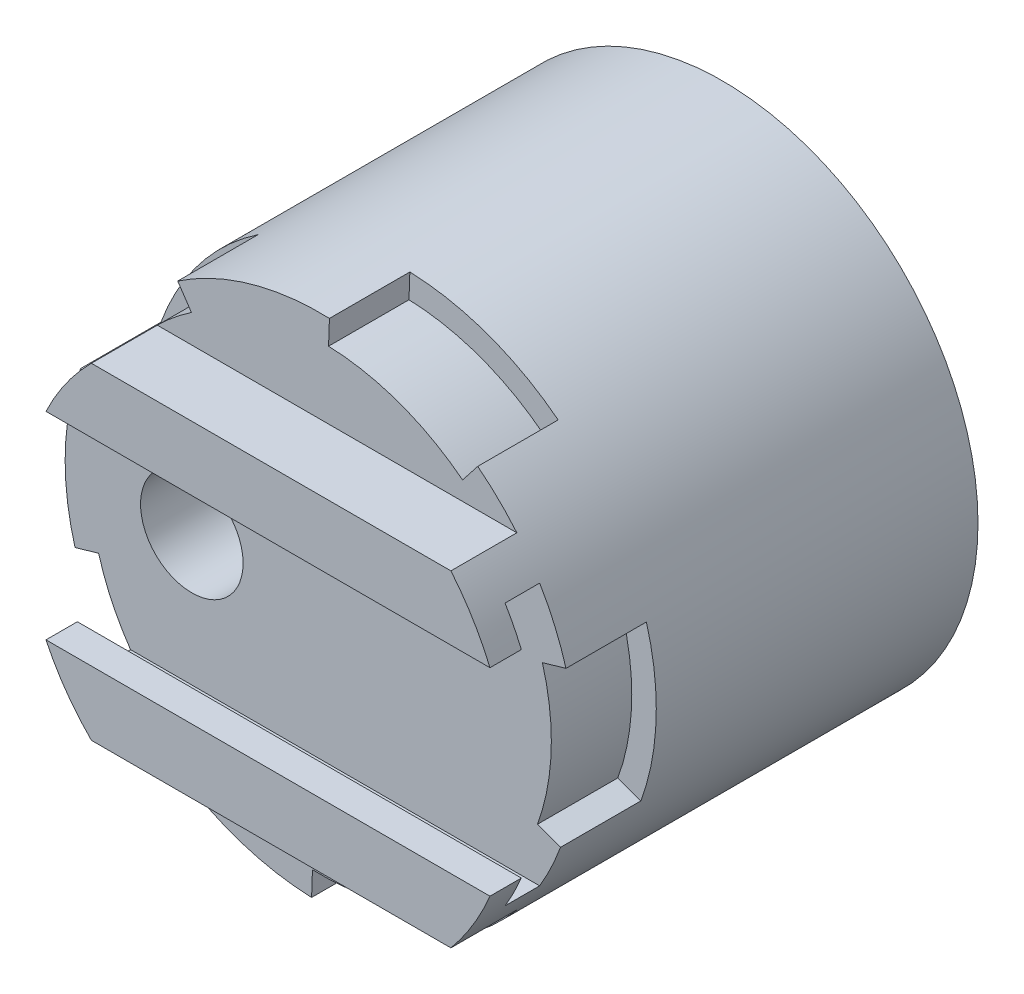
ISO-10303-21;
HEADER;
FILE_DESCRIPTION(('STEP AP214'),'2;1');
FILE_NAME('part.step','',(''),(''),'','','');
FILE_SCHEMA(('AUTOMOTIVE_DESIGN { 1 0 10303 214 1 1 1 1 }'));
ENDSEC;
DATA;
#1=APPLICATION_CONTEXT('core data for automotive mechanical design processes');
#2=APPLICATION_PROTOCOL_DEFINITION('international standard','automotive_design',2000,#1);
#3=PRODUCT_CONTEXT('',#1,'mechanical');
#4=PRODUCT('Part','Part','',(#3));
#5=PRODUCT_RELATED_PRODUCT_CATEGORY('part','',(#4));
#6=PRODUCT_DEFINITION_FORMATION('','',#4);
#7=PRODUCT_DEFINITION_CONTEXT('part definition',#1,'design');
#8=PRODUCT_DEFINITION('design','',#6,#7);
#9=PRODUCT_DEFINITION_SHAPE('','',#8);
#10=(LENGTH_UNIT() NAMED_UNIT(*) SI_UNIT(.MILLI.,.METRE.));
#11=(NAMED_UNIT(*) PLANE_ANGLE_UNIT() SI_UNIT($,.RADIAN.));
#12=(NAMED_UNIT(*) SI_UNIT($,.STERADIAN.) SOLID_ANGLE_UNIT());
#13=UNCERTAINTY_MEASURE_WITH_UNIT(LENGTH_MEASURE(1.E-05),#10,'distance_accuracy_value','');
#14=(GEOMETRIC_REPRESENTATION_CONTEXT(3) GLOBAL_UNCERTAINTY_ASSIGNED_CONTEXT((#13)) GLOBAL_UNIT_ASSIGNED_CONTEXT((#10,
#11,#12)) REPRESENTATION_CONTEXT('',''));
#15=CARTESIAN_POINT('',(0.,0.,0.));
#16=DIRECTION('',(0.,0.,1.));
#17=DIRECTION('',(1.,0.,0.));
#18=AXIS2_PLACEMENT_3D('',#15,#16,#17);
#19=CARTESIAN_POINT('',(-30.,-20.3,58.2));
#20=DIRECTION('',(0.,0.,1.));
#21=DIRECTION('',(1.,0.,0.));
#22=AXIS2_PLACEMENT_3D('',#19,#20,#21);
#23=PLANE('',#22);
#24=CARTESIAN_POINT('',(0.,0.,58.2));
#25=DIRECTION('',(0.,0.,1.));
#26=DIRECTION('',(1.,0.,0.));
#27=AXIS2_PLACEMENT_3D('',#24,#25,#26);
#28=CIRCLE('',#27,28.7);
#29=CARTESIAN_POINT('',(-25.9306768133807,-12.3,58.2));
#30=VERTEX_POINT('',#29);
#31=CARTESIAN_POINT('',(-20.2879274446652,-20.3,58.2));
#32=VERTEX_POINT('',#31);
#33=EDGE_CURVE('E453',#30,#32,#28,.T.);
#34=ORIENTED_EDGE('',*,*,#33,.T.);
#35=DIRECTION('',(1.,0.,0.));
#36=VECTOR('',#35,1.);
#37=CARTESIAN_POINT('',(-30.,-20.3,58.2));
#38=LINE('',#37,#36);
#39=CARTESIAN_POINT('',(24.412548003025,-20.3,58.2));
#40=VERTEX_POINT('',#39);
#41=EDGE_CURVE('E288',#32,#40,#38,.T.);
#42=ORIENTED_EDGE('',*,*,#41,.T.);
#43=CARTESIAN_POINT('',(0.,0.,58.2));
#44=DIRECTION('',(0.,0.,1.));
#45=DIRECTION('',(1.,0.,0.));
#46=AXIS2_PLACEMENT_3D('',#43,#44,#45);
#47=CIRCLE('',#46,31.75);
#48=CARTESIAN_POINT('',(29.2706764527231,-12.3,58.2));
#49=VERTEX_POINT('',#48);
#50=EDGE_CURVE('E55',#40,#49,#47,.T.);
#51=ORIENTED_EDGE('',*,*,#50,.T.);
#52=DIRECTION('',(1.,0.,0.));
#53=VECTOR('',#52,1.);
#54=CARTESIAN_POINT('',(-30.,-12.3,58.2));
#55=LINE('',#54,#53);
#56=EDGE_CURVE('E296',#30,#49,#55,.T.);
#57=ORIENTED_EDGE('',*,*,#56,.F.);
#58=EDGE_LOOP('',(#34,#42,#51,#57));
#59=FACE_BOUND('',#58,.T.);
#60=ADVANCED_FACE('F40',(#59),#23,.T.);
#61=CARTESIAN_POINT('',(-30.,-12.3,54.3));
#62=DIRECTION('',(0.,0.,-1.));
#63=DIRECTION('',(-1.,0.,0.));
#64=AXIS2_PLACEMENT_3D('',#61,#62,#63);
#65=PLANE('',#64);
#66=CARTESIAN_POINT('',(0.,0.,54.3));
#67=DIRECTION('',(0.,0.,-1.));
#68=DIRECTION('',(-1.,0.,0.));
#69=AXIS2_PLACEMENT_3D('',#66,#67,#68);
#70=CIRCLE('',#69,28.7);
#71=CARTESIAN_POINT('',(-25.9306768133807,-12.3,54.3));
#72=VERTEX_POINT('',#71);
#73=CARTESIAN_POINT('',(-23.6220236220354,-16.3,54.3));
#74=VERTEX_POINT('',#73);
#75=EDGE_CURVE('E253',#72,#74,#70,.F.);
#76=ORIENTED_EDGE('',*,*,#75,.F.);
#77=DIRECTION('',(1.,0.,0.));
#78=VECTOR('',#77,1.);
#79=CARTESIAN_POINT('',(-30.,-12.3,54.3));
#80=LINE('',#79,#78);
#81=CARTESIAN_POINT('',(29.2706764527231,-12.3,54.3));
#82=VERTEX_POINT('',#81);
#83=EDGE_CURVE('E505',#72,#82,#80,.T.);
#84=ORIENTED_EDGE('',*,*,#83,.T.);
#85=CARTESIAN_POINT('',(0.,0.,54.3));
#86=DIRECTION('',(0.,0.,-1.));
#87=DIRECTION('',(-1.,0.,0.));
#88=AXIS2_PLACEMENT_3D('',#85,#86,#87);
#89=CIRCLE('',#88,31.75);
#90=CARTESIAN_POINT('',(27.2465135384328,-16.3,54.3));
#91=VERTEX_POINT('',#90);
#92=EDGE_CURVE('E482',#91,#82,#89,.F.);
#93=ORIENTED_EDGE('',*,*,#92,.F.);
#94=DIRECTION('',(1.,0.,0.));
#95=VECTOR('',#94,1.);
#96=CARTESIAN_POINT('',(-30.,-16.3,54.3));
#97=LINE('',#96,#95);
#98=EDGE_CURVE('E285',#74,#91,#97,.T.);
#99=ORIENTED_EDGE('',*,*,#98,.F.);
#100=EDGE_LOOP('',(#76,#84,#93,#99));
#101=FACE_BOUND('',#100,.T.);
#102=ADVANCED_FACE('F510',(#101),#65,.T.);
#103=CARTESIAN_POINT('',(-30.,20.3,58.2));
#104=DIRECTION('',(0.,0.,-1.));
#105=DIRECTION('',(-1.,0.,0.));
#106=AXIS2_PLACEMENT_3D('',#103,#104,#105);
#107=PLANE('',#106);
#108=DIRECTION('',(1.,0.,0.));
#109=VECTOR('',#108,1.);
#110=CARTESIAN_POINT('',(-30.,12.3,58.2));
#111=LINE('',#110,#109);
#112=CARTESIAN_POINT('',(-25.9306768133807,12.3,58.2));
#113=VERTEX_POINT('',#112);
#114=CARTESIAN_POINT('',(29.2706764527231,12.3,58.2));
#115=VERTEX_POINT('',#114);
#116=EDGE_CURVE('E488',#113,#115,#111,.T.);
#117=ORIENTED_EDGE('',*,*,#116,.T.);
#118=CARTESIAN_POINT('',(0.,0.,58.2));
#119=DIRECTION('',(0.,0.,1.));
#120=DIRECTION('',(1.,0.,0.));
#121=AXIS2_PLACEMENT_3D('',#118,#119,#120);
#122=CIRCLE('',#121,31.75);
#123=CARTESIAN_POINT('',(24.412548003025,20.3,58.2));
#124=VERTEX_POINT('',#123);
#125=EDGE_CURVE('E62',#115,#124,#122,.T.);
#126=ORIENTED_EDGE('',*,*,#125,.T.);
#127=DIRECTION('',(1.,0.,0.));
#128=VECTOR('',#127,1.);
#129=CARTESIAN_POINT('',(-30.,20.3,58.2));
#130=LINE('',#129,#128);
#131=CARTESIAN_POINT('',(-20.2879274446652,20.3,58.2));
#132=VERTEX_POINT('',#131);
#133=EDGE_CURVE('E291',#132,#124,#130,.T.);
#134=ORIENTED_EDGE('',*,*,#133,.F.);
#135=CARTESIAN_POINT('',(0.,0.,58.2));
#136=DIRECTION('',(0.,0.,1.));
#137=DIRECTION('',(1.,0.,0.));
#138=AXIS2_PLACEMENT_3D('',#135,#136,#137);
#139=CIRCLE('',#138,28.7);
#140=EDGE_CURVE('E462',#132,#113,#139,.T.);
#141=ORIENTED_EDGE('',*,*,#140,.T.);
#142=EDGE_LOOP('',(#117,#126,#134,#141));
#143=FACE_BOUND('',#142,.T.);
#144=ADVANCED_FACE('F539',(#143),#107,.F.);
#145=CARTESIAN_POINT('',(-30.,12.3,54.3));
#146=DIRECTION('',(0.,0.,1.));
#147=DIRECTION('',(1.,0.,0.));
#148=AXIS2_PLACEMENT_3D('',#145,#146,#147);
#149=PLANE('',#148);
#150=DIRECTION('',(1.,0.,0.));
#151=VECTOR('',#150,1.);
#152=CARTESIAN_POINT('',(-30.,16.3,54.3));
#153=LINE('',#152,#151);
#154=CARTESIAN_POINT('',(-23.6220236220354,16.3,54.3));
#155=VERTEX_POINT('',#154);
#156=CARTESIAN_POINT('',(27.2465135384328,16.3,54.3));
#157=VERTEX_POINT('',#156);
#158=EDGE_CURVE('E497',#155,#157,#153,.T.);
#159=ORIENTED_EDGE('',*,*,#158,.T.);
#160=CARTESIAN_POINT('',(0.,0.,54.3));
#161=DIRECTION('',(0.,0.,1.));
#162=DIRECTION('',(1.,0.,0.));
#163=AXIS2_PLACEMENT_3D('',#160,#161,#162);
#164=CIRCLE('',#163,31.75);
#165=CARTESIAN_POINT('',(29.2706764527231,12.3,54.3));
#166=VERTEX_POINT('',#165);
#167=EDGE_CURVE('E473',#157,#166,#164,.F.);
#168=ORIENTED_EDGE('',*,*,#167,.T.);
#169=DIRECTION('',(1.,0.,0.));
#170=VECTOR('',#169,1.);
#171=CARTESIAN_POINT('',(-30.,12.3,54.3));
#172=LINE('',#171,#170);
#173=CARTESIAN_POINT('',(-25.9306768133807,12.3,54.3));
#174=VERTEX_POINT('',#173);
#175=EDGE_CURVE('E500',#174,#166,#172,.T.);
#176=ORIENTED_EDGE('',*,*,#175,.F.);
#177=CARTESIAN_POINT('',(0.,0.,54.3));
#178=DIRECTION('',(0.,0.,1.));
#179=DIRECTION('',(1.,0.,0.));
#180=AXIS2_PLACEMENT_3D('',#177,#178,#179);
#181=CIRCLE('',#180,28.7);
#182=EDGE_CURVE('E465',#174,#155,#181,.F.);
#183=ORIENTED_EDGE('',*,*,#182,.T.);
#184=EDGE_LOOP('',(#159,#168,#176,#183));
#185=FACE_BOUND('',#184,.T.);
#186=ADVANCED_FACE('F616',(#185),#149,.F.);
#187=CARTESIAN_POINT('',(0.,0.,50.));
#188=DIRECTION('',(0.,0.,1.));
#189=DIRECTION('',(1.,0.,0.));
#190=AXIS2_PLACEMENT_3D('',#187,#188,#189);
#191=PLANE('',#190);
#192=CARTESIAN_POINT('',(0.,0.,50.));
#193=DIRECTION('',(0.,0.,1.));
#194=DIRECTION('',(1.,0.,0.));
#195=AXIS2_PLACEMENT_3D('',#192,#193,#194);
#196=CIRCLE('',#195,28.7);
#197=CARTESIAN_POINT('',(-16.0488363296106,23.7933783323296,50.));
#198=VERTEX_POINT('',#197);
#199=CARTESIAN_POINT('',(-20.2879274446652,20.3,50.));
#200=VERTEX_POINT('',#199);
#201=EDGE_CURVE('E274',#198,#200,#196,.T.);
#202=ORIENTED_EDGE('',*,*,#201,.T.);
#203=DIRECTION('',(1.,0.,0.));
#204=VECTOR('',#203,1.);
#205=CARTESIAN_POINT('',(-30.,20.3,50.));
#206=LINE('',#205,#204);
#207=CARTESIAN_POINT('',(24.412548003025,20.3,50.));
#208=VERTEX_POINT('',#207);
#209=EDGE_CURVE('E491',#200,#208,#206,.T.);
#210=ORIENTED_EDGE('',*,*,#209,.T.);
#211=CARTESIAN_POINT('',(0.,0.,50.));
#212=DIRECTION('',(0.,0.,1.));
#213=DIRECTION('',(1.,0.,0.));
#214=AXIS2_PLACEMENT_3D('',#211,#212,#213);
#215=CIRCLE('',#214,31.75);
#216=CARTESIAN_POINT('',(19.5472518415895,25.0193414270136,50.));
#217=VERTEX_POINT('',#216);
#218=EDGE_CURVE('E347',#208,#217,#215,.T.);
#219=ORIENTED_EDGE('',*,*,#218,.T.);
#220=DIRECTION('',(0.615661475325653,0.788010753606726,0.));
#221=VECTOR('',#220,1.);
#222=CARTESIAN_POINT('',(0.,0.,50.));
#223=LINE('',#222,#221);
#224=CARTESIAN_POINT('',(17.6694843418462,22.615908628513,50.));
#225=VERTEX_POINT('',#224);
#226=EDGE_CURVE('E350',#225,#217,#223,.T.);
#227=ORIENTED_EDGE('',*,*,#226,.F.);
#228=CARTESIAN_POINT('',(1.00161555536159,28.6825167354481,50.));
#229=VERTEX_POINT('',#228);
#230=EDGE_CURVE('E628',#225,#229,#196,.T.);
#231=ORIENTED_EDGE('',*,*,#230,.T.);
#232=DIRECTION('',(-0.0348994967024945,-0.999390827019096,0.));
#233=VECTOR('',#232,1.);
#234=CARTESIAN_POINT('',(0.,0.,50.));
#235=LINE('',#234,#233);
#236=CARTESIAN_POINT('',(1.1080590203042,31.7306587578563,50.));
#237=VERTEX_POINT('',#236);
#238=EDGE_CURVE('E370',#237,#229,#235,.T.);
#239=ORIENTED_EDGE('',*,*,#238,.F.);
#240=CARTESIAN_POINT('',(0.,0.,50.));
#241=DIRECTION('',(0.,0.,1.));
#242=DIRECTION('',(1.,0.,0.));
#243=AXIS2_PLACEMENT_3D('',#240,#241,#242);
#244=CIRCLE('',#243,31.75);
#245=CARTESIAN_POINT('',(-17.7543746851964,26.3219429286225,50.));
#246=VERTEX_POINT('',#245);
#247=EDGE_CURVE('E373',#237,#246,#244,.T.);
#248=ORIENTED_EDGE('',*,*,#247,.T.);
#249=DIRECTION('',(-0.559192903470752,0.829037572555038,0.));
#250=VECTOR('',#249,1.);
#251=CARTESIAN_POINT('',(0.,0.,50.));
#252=LINE('',#251,#250);
#253=EDGE_CURVE('E376',#198,#246,#252,.T.);
#254=ORIENTED_EDGE('',*,*,#253,.F.);
#255=EDGE_LOOP('',(#202,#210,#219,#227,#231,#239,#248,#254));
#256=FACE_BOUND('',#255,.T.);
#257=ADVANCED_FACE('F593',(#256),#191,.T.);
#258=CARTESIAN_POINT('',(-16.,0.,50.));
#259=DIRECTION('',(0.,0.,1.));
#260=DIRECTION('',(1.,0.,0.));
#261=AXIS2_PLACEMENT_3D('',#258,#259,#260);
#262=CIRCLE('',#261,6.375);
#263=CARTESIAN_POINT('',(-9.625,0.,50.));
#264=VERTEX_POINT('',#263);
#265=EDGE_CURVE('E420',#264,#264,#262,.F.);
#266=ORIENTED_EDGE('',*,*,#265,.T.);
#267=EDGE_LOOP('',(#266));
#268=FACE_BOUND('',#267,.T.);
#269=CARTESIAN_POINT('',(30.5200588460416,8.75148604718993,50.));
#270=VERTEX_POINT('',#269);
#271=CARTESIAN_POINT('',(27.2465135384328,16.3,50.));
#272=VERTEX_POINT('',#271);
#273=EDGE_CURVE('E348',#270,#272,#215,.T.);
#274=ORIENTED_EDGE('',*,*,#273,.T.);
#275=DIRECTION('',(1.,0.,0.));
#276=VECTOR('',#275,1.);
#277=CARTESIAN_POINT('',(-30.,16.3,50.));
#278=LINE('',#277,#276);
#279=CARTESIAN_POINT('',(-23.6220236220354,16.3,50.));
#280=VERTEX_POINT('',#279);
#281=EDGE_CURVE('E494',#280,#272,#278,.T.);
#282=ORIENTED_EDGE('',*,*,#281,.F.);
#283=CARTESIAN_POINT('',(-26.9691782165556,9.81597811344652,50.));
#284=VERTEX_POINT('',#283);
#285=EDGE_CURVE('E273',#280,#284,#196,.T.);
#286=ORIENTED_EDGE('',*,*,#285,.T.);
#287=DIRECTION('',(0.939692620785911,-0.342020143325663,0.));
#288=VECTOR('',#287,1.);
#289=CARTESIAN_POINT('',(0.,0.,50.));
#290=LINE('',#289,#288);
#291=CARTESIAN_POINT('',(-29.8352407099527,10.8591395505898,50.));
#292=VERTEX_POINT('',#291);
#293=EDGE_CURVE('E395',#292,#284,#290,.T.);
#294=ORIENTED_EDGE('',*,*,#293,.F.);
#295=CARTESIAN_POINT('',(0.,0.,50.));
#296=DIRECTION('',(0.,0.,1.));
#297=DIRECTION('',(1.,0.,0.));
#298=AXIS2_PLACEMENT_3D('',#295,#296,#297);
#299=CIRCLE('',#298,31.75);
#300=CARTESIAN_POINT('',(-30.5200588460416,-8.75148604718992,50.));
#301=VERTEX_POINT('',#300);
#302=EDGE_CURVE('E396',#292,#301,#299,.T.);
#303=ORIENTED_EDGE('',*,*,#302,.T.);
#304=DIRECTION('',(-0.961261695938317,-0.275637355817006,0.));
#305=VECTOR('',#304,1.);
#306=CARTESIAN_POINT('',(0.,0.,50.));
#307=LINE('',#306,#305);
#308=CARTESIAN_POINT('',(-27.5882106734297,-7.91079211194806,50.));
#309=VERTEX_POINT('',#308);
#310=EDGE_CURVE('E269',#309,#301,#307,.T.);
#311=ORIENTED_EDGE('',*,*,#310,.F.);
#312=CARTESIAN_POINT('',(-23.6220236220354,-16.3,50.));
#313=VERTEX_POINT('',#312);
#314=EDGE_CURVE('E250',#309,#313,#196,.T.);
#315=ORIENTED_EDGE('',*,*,#314,.T.);
#316=DIRECTION('',(1.,0.,0.));
#317=VECTOR('',#316,1.);
#318=CARTESIAN_POINT('',(-30.,-16.3,50.));
#319=LINE('',#318,#317);
#320=CARTESIAN_POINT('',(27.2465135384328,-16.3,50.));
#321=VERTEX_POINT('',#320);
#322=EDGE_CURVE('E265',#313,#321,#319,.T.);
#323=ORIENTED_EDGE('',*,*,#322,.T.);
#324=CARTESIAN_POINT('',(0.,0.,50.));
#325=DIRECTION('',(0.,0.,1.));
#326=DIRECTION('',(1.,0.,0.));
#327=AXIS2_PLACEMENT_3D('',#324,#325,#326);
#328=CIRCLE('',#327,31.75);
#329=CARTESIAN_POINT('',(29.8352407099527,-10.8591395505898,50.));
#330=VERTEX_POINT('',#329);
#331=EDGE_CURVE('E320',#321,#330,#328,.T.);
#332=ORIENTED_EDGE('',*,*,#331,.T.);
#333=DIRECTION('',(0.939692620785911,-0.342020143325663,0.));
#334=VECTOR('',#333,1.);
#335=CARTESIAN_POINT('',(0.,0.,50.));
#336=LINE('',#335,#334);
#337=CARTESIAN_POINT('',(26.9691782165556,-9.81597811344652,50.));
#338=VERTEX_POINT('',#337);
#339=EDGE_CURVE('E324',#338,#330,#336,.T.);
#340=ORIENTED_EDGE('',*,*,#339,.F.);
#341=CARTESIAN_POINT('',(27.5882106734297,7.91079211194806,50.));
#342=VERTEX_POINT('',#341);
#343=EDGE_CURVE('E656',#338,#342,#196,.T.);
#344=ORIENTED_EDGE('',*,*,#343,.T.);
#345=DIRECTION('',(-0.961261695938317,-0.275637355817006,0.));
#346=VECTOR('',#345,1.);
#347=CARTESIAN_POINT('',(0.,0.,50.));
#348=LINE('',#347,#346);
#349=EDGE_CURVE('E344',#270,#342,#348,.T.);
#350=ORIENTED_EDGE('',*,*,#349,.F.);
#351=EDGE_LOOP('',(#274,#282,#286,#294,#303,#311,#315,#323,#332,#340,#344,#350));
#352=FACE_BOUND('',#351,.T.);
#353=ADVANCED_FACE('F264',(#268,#352),#191,.T.);
#354=CARTESIAN_POINT('',(0.,0.,50.));
#355=DIRECTION('',(0.,0.,-1.));
#356=DIRECTION('',(-1.,0.,0.));
#357=AXIS2_PLACEMENT_3D('',#354,#355,#356);
#358=CYLINDRICAL_SURFACE('',#357,28.7);
#359=DIRECTION('',(0.,0.,1.));
#360=VECTOR('',#359,1.);
#361=CARTESIAN_POINT('',(-1.00161555536159,-28.6825167354481,-500000.));
#362=LINE('',#361,#360);
#363=CARTESIAN_POINT('',(-1.00161555536159,-28.6825167354481,40.));
#364=VERTEX_POINT('',#363);
#365=CARTESIAN_POINT('',(-1.00161555536159,-28.6825167354481,50.));
#366=VERTEX_POINT('',#365);
#367=EDGE_CURVE('E304',#364,#366,#362,.T.);
#368=ORIENTED_EDGE('',*,*,#367,.F.);
#369=CARTESIAN_POINT('',(0.,0.,40.));
#370=DIRECTION('',(0.,0.,1.));
#371=DIRECTION('',(1.,0.,0.));
#372=AXIS2_PLACEMENT_3D('',#369,#370,#371);
#373=CIRCLE('',#372,28.7);
#374=CARTESIAN_POINT('',(16.0488363296106,-23.7933783323296,40.));
#375=VERTEX_POINT('',#374);
#376=EDGE_CURVE('E433',#364,#375,#373,.T.);
#377=ORIENTED_EDGE('',*,*,#376,.T.);
#378=DIRECTION('',(0.,0.,1.));
#379=VECTOR('',#378,1.);
#380=CARTESIAN_POINT('',(16.0488363296106,-23.7933783323296,-500000.));
#381=LINE('',#380,#379);
#382=CARTESIAN_POINT('',(16.0488363296106,-23.7933783323296,50.));
#383=VERTEX_POINT('',#382);
#384=EDGE_CURVE('E327',#375,#383,#381,.T.);
#385=ORIENTED_EDGE('',*,*,#384,.T.);
#386=EDGE_CURVE('E654',#366,#383,#196,.T.);
#387=ORIENTED_EDGE('',*,*,#386,.F.);
#388=EDGE_LOOP('',(#368,#377,#385,#387));
#389=FACE_BOUND('',#388,.T.);
#390=ADVANCED_FACE('F609',(#389),#358,.T.);
#391=DIRECTION('',(0.,0.,1.));
#392=VECTOR('',#391,1.);
#393=CARTESIAN_POINT('',(-17.6694843418462,-22.615908628513,-500000.));
#394=LINE('',#393,#392);
#395=CARTESIAN_POINT('',(-17.6694843418462,-22.615908628513,40.));
#396=VERTEX_POINT('',#395);
#397=CARTESIAN_POINT('',(-17.6694843418462,-22.615908628513,50.));
#398=VERTEX_POINT('',#397);
#399=EDGE_CURVE('E302',#396,#398,#394,.T.);
#400=ORIENTED_EDGE('',*,*,#399,.T.);
#401=CARTESIAN_POINT('',(-20.2879274446652,-20.3,50.));
#402=VERTEX_POINT('',#401);
#403=EDGE_CURVE('E271',#402,#398,#196,.T.);
#404=ORIENTED_EDGE('',*,*,#403,.F.);
#405=DIRECTION('',(0.,0.,-1.));
#406=VECTOR('',#405,1.);
#407=CARTESIAN_POINT('',(-20.2879274446652,-20.3,58.2));
#408=LINE('',#407,#406);
#409=EDGE_CURVE('E13',#402,#32,#408,.F.);
#410=ORIENTED_EDGE('',*,*,#409,.T.);
#411=ORIENTED_EDGE('',*,*,#33,.F.);
#412=DIRECTION('',(0.,0.,-1.));
#413=VECTOR('',#412,1.);
#414=CARTESIAN_POINT('',(-25.9306768133807,-12.3,58.2));
#415=LINE('',#414,#413);
#416=EDGE_CURVE('E486',#30,#72,#415,.T.);
#417=ORIENTED_EDGE('',*,*,#416,.T.);
#418=ORIENTED_EDGE('',*,*,#75,.T.);
#419=DIRECTION('',(0.,0.,-1.));
#420=VECTOR('',#419,1.);
#421=CARTESIAN_POINT('',(-23.6220236220354,-16.3,58.2));
#422=LINE('',#421,#420);
#423=EDGE_CURVE('E246',#74,#313,#422,.T.);
#424=ORIENTED_EDGE('',*,*,#423,.T.);
#425=ORIENTED_EDGE('',*,*,#314,.F.);
#426=DIRECTION('',(0.,0.,1.));
#427=VECTOR('',#426,1.);
#428=CARTESIAN_POINT('',(-27.5882106734297,-7.91079211194806,-500000.));
#429=LINE('',#428,#427);
#430=CARTESIAN_POINT('',(-27.5882106734297,-7.91079211194806,40.));
#431=VERTEX_POINT('',#430);
#432=EDGE_CURVE('E399',#431,#309,#429,.T.);
#433=ORIENTED_EDGE('',*,*,#432,.F.);
#434=EDGE_CURVE('E429',#431,#396,#373,.T.);
#435=ORIENTED_EDGE('',*,*,#434,.T.);
#436=EDGE_LOOP('',(#400,#404,#410,#411,#417,#418,#424,#425,#433,#435));
#437=FACE_BOUND('',#436,.T.);
#438=ADVANCED_FACE('F249',(#437),#358,.T.);
#439=CARTESIAN_POINT('',(0.,0.,40.));
#440=DIRECTION('',(0.,0.,1.));
#441=DIRECTION('',(1.,0.,0.));
#442=AXIS2_PLACEMENT_3D('',#439,#440,#441);
#443=PLANE('',#442);
#444=ORIENTED_EDGE('',*,*,#376,.F.);
#445=DIRECTION('',(0.0348994967024945,0.999390827019096,0.));
#446=VECTOR('',#445,1.);
#447=CARTESIAN_POINT('',(0.,0.,40.0000000000205));
#448=LINE('',#447,#446);
#449=CARTESIAN_POINT('',(-1.1080590203042,-31.7306587578563,39.9999999999068));
#450=VERTEX_POINT('',#449);
#451=EDGE_CURVE('E311',#450,#364,#448,.T.);
#452=ORIENTED_EDGE('',*,*,#451,.F.);
#453=CARTESIAN_POINT('',(0.,0.,40.));
#454=DIRECTION('',(0.,0.,1.));
#455=DIRECTION('',(1.,0.,0.));
#456=AXIS2_PLACEMENT_3D('',#453,#454,#455);
#457=CIRCLE('',#456,31.75);
#458=CARTESIAN_POINT('',(17.7543746851964,-26.3219429286225,40.));
#459=VERTEX_POINT('',#458);
#460=EDGE_CURVE('E436',#450,#459,#457,.T.);
#461=ORIENTED_EDGE('',*,*,#460,.T.);
#462=DIRECTION('',(0.559192903470752,-0.829037572555038,0.));
#463=VECTOR('',#462,1.);
#464=CARTESIAN_POINT('',(0.,0.,40.0000000000205));
#465=LINE('',#464,#463);
#466=EDGE_CURVE('E341',#375,#459,#465,.T.);
#467=ORIENTED_EDGE('',*,*,#466,.F.);
#468=EDGE_LOOP('',(#444,#452,#461,#467));
#469=FACE_BOUND('',#468,.T.);
#470=ADVANCED_FACE('F589',(#469),#443,.T.);
#471=CARTESIAN_POINT('',(-30.5200588460416,-8.75148604718992,39.9999999999068));
#472=VERTEX_POINT('',#471);
#473=CARTESIAN_POINT('',(-19.5472518415895,-25.0193414270136,40.));
#474=VERTEX_POINT('',#473);
#475=EDGE_CURVE('E434',#472,#474,#457,.T.);
#476=ORIENTED_EDGE('',*,*,#475,.T.);
#477=DIRECTION('',(-0.615661475325653,-0.788010753606726,0.));
#478=VECTOR('',#477,1.);
#479=CARTESIAN_POINT('',(0.,0.,40.0000000000205));
#480=LINE('',#479,#478);
#481=EDGE_CURVE('E314',#396,#474,#480,.T.);
#482=ORIENTED_EDGE('',*,*,#481,.F.);
#483=ORIENTED_EDGE('',*,*,#434,.F.);
#484=DIRECTION('',(0.961261695938317,0.275637355817005,0.));
#485=VECTOR('',#484,1.);
#486=CARTESIAN_POINT('',(0.,0.,40.0000000000205));
#487=LINE('',#486,#485);
#488=EDGE_CURVE('E410',#472,#431,#487,.T.);
#489=ORIENTED_EDGE('',*,*,#488,.F.);
#490=EDGE_LOOP('',(#476,#482,#483,#489));
#491=FACE_BOUND('',#490,.T.);
#492=ADVANCED_FACE('F833',(#491),#443,.T.);
#493=DIRECTION('',(0.,0.,1.));
#494=VECTOR('',#493,1.);
#495=CARTESIAN_POINT('',(26.9691782165556,-9.81597811344652,-500000.));
#496=LINE('',#495,#494);
#497=CARTESIAN_POINT('',(26.9691782165556,-9.81597811344652,40.));
#498=VERTEX_POINT('',#497);
#499=EDGE_CURVE('E330',#498,#338,#496,.T.);
#500=ORIENTED_EDGE('',*,*,#499,.F.);
#501=CARTESIAN_POINT('',(27.5882106734297,7.91079211194806,40.));
#502=VERTEX_POINT('',#501);
#503=EDGE_CURVE('E644',#498,#502,#373,.T.);
#504=ORIENTED_EDGE('',*,*,#503,.T.);
#505=DIRECTION('',(0.,0.,1.));
#506=VECTOR('',#505,1.);
#507=CARTESIAN_POINT('',(27.5882106734297,7.91079211194806,-500000.));
#508=LINE('',#507,#506);
#509=EDGE_CURVE('E353',#502,#342,#508,.T.);
#510=ORIENTED_EDGE('',*,*,#509,.T.);
#511=ORIENTED_EDGE('',*,*,#343,.F.);
#512=EDGE_LOOP('',(#500,#504,#510,#511));
#513=FACE_BOUND('',#512,.T.);
#514=ADVANCED_FACE('F662',(#513),#358,.T.);
#515=ORIENTED_EDGE('',*,*,#503,.F.);
#516=DIRECTION('',(-0.939692620785911,0.342020143325663,0.));
#517=VECTOR('',#516,1.);
#518=CARTESIAN_POINT('',(0.,0.,40.0000000000205));
#519=LINE('',#518,#517);
#520=CARTESIAN_POINT('',(29.8352407099527,-10.8591395505898,39.9999999999068));
#521=VERTEX_POINT('',#520);
#522=EDGE_CURVE('E338',#521,#498,#519,.T.);
#523=ORIENTED_EDGE('',*,*,#522,.F.);
#524=CARTESIAN_POINT('',(30.5200588460416,8.75148604718992,40.));
#525=VERTEX_POINT('',#524);
#526=EDGE_CURVE('E937',#521,#525,#457,.T.);
#527=ORIENTED_EDGE('',*,*,#526,.T.);
#528=DIRECTION('',(0.961261695938317,0.275637355817005,0.));
#529=VECTOR('',#528,1.);
#530=CARTESIAN_POINT('',(0.,0.,40.0000000000205));
#531=LINE('',#530,#529);
#532=EDGE_CURVE('E367',#502,#525,#531,.T.);
#533=ORIENTED_EDGE('',*,*,#532,.F.);
#534=EDGE_LOOP('',(#515,#523,#527,#533));
#535=FACE_BOUND('',#534,.T.);
#536=ADVANCED_FACE('F819',(#535),#443,.T.);
#537=DIRECTION('',(0.,0.,1.));
#538=VECTOR('',#537,1.);
#539=CARTESIAN_POINT('',(17.6694843418462,22.615908628513,-500000.));
#540=LINE('',#539,#538);
#541=CARTESIAN_POINT('',(17.6694843418462,22.615908628513,40.));
#542=VERTEX_POINT('',#541);
#543=EDGE_CURVE('E356',#542,#225,#540,.T.);
#544=ORIENTED_EDGE('',*,*,#543,.F.);
#545=CARTESIAN_POINT('',(1.00161555536159,28.6825167354481,40.));
#546=VERTEX_POINT('',#545);
#547=EDGE_CURVE('E640',#542,#546,#373,.T.);
#548=ORIENTED_EDGE('',*,*,#547,.T.);
#549=DIRECTION('',(0.,0.,1.));
#550=VECTOR('',#549,1.);
#551=CARTESIAN_POINT('',(1.00161555536159,28.6825167354481,-500000.));
#552=LINE('',#551,#550);
#553=EDGE_CURVE('E379',#546,#229,#552,.T.);
#554=ORIENTED_EDGE('',*,*,#553,.T.);
#555=ORIENTED_EDGE('',*,*,#230,.F.);
#556=EDGE_LOOP('',(#544,#548,#554,#555));
#557=FACE_BOUND('',#556,.T.);
#558=ADVANCED_FACE('F639',(#557),#358,.T.);
#559=ORIENTED_EDGE('',*,*,#547,.F.);
#560=DIRECTION('',(-0.615661475325653,-0.788010753606726,0.));
#561=VECTOR('',#560,1.);
#562=CARTESIAN_POINT('',(0.,0.,40.0000000000205));
#563=LINE('',#562,#561);
#564=CARTESIAN_POINT('',(19.5472518415895,25.0193414270136,39.9999999999068));
#565=VERTEX_POINT('',#564);
#566=EDGE_CURVE('E364',#565,#542,#563,.T.);
#567=ORIENTED_EDGE('',*,*,#566,.F.);
#568=CARTESIAN_POINT('',(1.1080590203042,31.7306587578563,40.));
#569=VERTEX_POINT('',#568);
#570=EDGE_CURVE('E938',#565,#569,#457,.T.);
#571=ORIENTED_EDGE('',*,*,#570,.T.);
#572=DIRECTION('',(0.0348994967024945,0.999390827019096,0.));
#573=VECTOR('',#572,1.);
#574=CARTESIAN_POINT('',(0.,0.,40.0000000000205));
#575=LINE('',#574,#573);
#576=EDGE_CURVE('E392',#546,#569,#575,.T.);
#577=ORIENTED_EDGE('',*,*,#576,.F.);
#578=EDGE_LOOP('',(#559,#567,#571,#577));
#579=FACE_BOUND('',#578,.T.);
#580=ADVANCED_FACE('F590',(#579),#443,.T.);
#581=DIRECTION('',(0.,0.,1.));
#582=VECTOR('',#581,1.);
#583=CARTESIAN_POINT('',(-16.0488363296106,23.7933783323296,-500000.));
#584=LINE('',#583,#582);
#585=CARTESIAN_POINT('',(-16.0488363296106,23.7933783323296,40.));
#586=VERTEX_POINT('',#585);
#587=EDGE_CURVE('E382',#586,#198,#584,.T.);
#588=ORIENTED_EDGE('',*,*,#587,.F.);
#589=CARTESIAN_POINT('',(-26.9691782165556,9.81597811344652,40.));
#590=VERTEX_POINT('',#589);
#591=EDGE_CURVE('E428',#586,#590,#373,.T.);
#592=ORIENTED_EDGE('',*,*,#591,.T.);
#593=DIRECTION('',(0.,0.,1.));
#594=VECTOR('',#593,1.);
#595=CARTESIAN_POINT('',(-26.9691782165556,9.81597811344652,-500000.));
#596=LINE('',#595,#594);
#597=EDGE_CURVE('E407',#590,#284,#596,.T.);
#598=ORIENTED_EDGE('',*,*,#597,.T.);
#599=ORIENTED_EDGE('',*,*,#285,.F.);
#600=DIRECTION('',(0.,0.,-1.));
#601=VECTOR('',#600,1.);
#602=CARTESIAN_POINT('',(-23.6220236220354,16.3,58.2));
#603=LINE('',#602,#601);
#604=EDGE_CURVE('E468',#155,#280,#603,.T.);
#605=ORIENTED_EDGE('',*,*,#604,.F.);
#606=ORIENTED_EDGE('',*,*,#182,.F.);
#607=DIRECTION('',(0.,0.,-1.));
#608=VECTOR('',#607,1.);
#609=CARTESIAN_POINT('',(-25.9306768133807,12.3,58.2));
#610=LINE('',#609,#608);
#611=EDGE_CURVE('E277',#113,#174,#610,.T.);
#612=ORIENTED_EDGE('',*,*,#611,.F.);
#613=ORIENTED_EDGE('',*,*,#140,.F.);
#614=DIRECTION('',(0.,0.,-1.));
#615=VECTOR('',#614,1.);
#616=CARTESIAN_POINT('',(-20.2879274446652,20.3,58.2));
#617=LINE('',#616,#615);
#618=EDGE_CURVE('E470',#200,#132,#617,.F.);
#619=ORIENTED_EDGE('',*,*,#618,.F.);
#620=ORIENTED_EDGE('',*,*,#201,.F.);
#621=EDGE_LOOP('',(#588,#592,#598,#599,#605,#606,#612,#613,#619,#620));
#622=FACE_BOUND('',#621,.T.);
#623=ADVANCED_FACE('F42',(#622),#358,.T.);
#624=ORIENTED_EDGE('',*,*,#591,.F.);
#625=DIRECTION('',(0.559192903470752,-0.829037572555038,0.));
#626=VECTOR('',#625,1.);
#627=CARTESIAN_POINT('',(0.,0.,40.0000000000205));
#628=LINE('',#627,#626);
#629=CARTESIAN_POINT('',(-17.7543746851964,26.3219429286225,39.9999999999068));
#630=VERTEX_POINT('',#629);
#631=EDGE_CURVE('E389',#630,#586,#628,.T.);
#632=ORIENTED_EDGE('',*,*,#631,.F.);
#633=CARTESIAN_POINT('',(-29.8352407099527,10.8591395505898,40.));
#634=VERTEX_POINT('',#633);
#635=EDGE_CURVE('E437',#630,#634,#457,.T.);
#636=ORIENTED_EDGE('',*,*,#635,.T.);
#637=DIRECTION('',(-0.939692620785911,0.342020143325663,0.));
#638=VECTOR('',#637,1.);
#639=CARTESIAN_POINT('',(0.,0.,40.0000000000205));
#640=LINE('',#639,#638);
#641=EDGE_CURVE('E413',#590,#634,#640,.T.);
#642=ORIENTED_EDGE('',*,*,#641,.F.);
#643=EDGE_LOOP('',(#624,#632,#636,#642));
#644=FACE_BOUND('',#643,.T.);
#645=ADVANCED_FACE('F585',(#644),#443,.T.);
#646=DIRECTION('',(1.,0.,0.));
#647=VECTOR('',#646,1.);
#648=CARTESIAN_POINT('',(-30.,-20.3,50.));
#649=LINE('',#648,#647);
#650=CARTESIAN_POINT('',(24.412548003025,-20.3,50.));
#651=VERTEX_POINT('',#650);
#652=EDGE_CURVE('E270',#402,#651,#649,.T.);
#653=ORIENTED_EDGE('',*,*,#652,.F.);
#654=ORIENTED_EDGE('',*,*,#403,.T.);
#655=DIRECTION('',(0.615661475325653,0.788010753606726,0.));
#656=VECTOR('',#655,1.);
#657=CARTESIAN_POINT('',(0.,0.,50.));
#658=LINE('',#657,#656);
#659=CARTESIAN_POINT('',(-19.5472518415895,-25.0193414270136,50.));
#660=VERTEX_POINT('',#659);
#661=EDGE_CURVE('E292',#660,#398,#658,.T.);
#662=ORIENTED_EDGE('',*,*,#661,.F.);
#663=CARTESIAN_POINT('',(0.,0.,50.));
#664=DIRECTION('',(0.,0.,1.));
#665=DIRECTION('',(1.,0.,0.));
#666=AXIS2_PLACEMENT_3D('',#663,#664,#665);
#667=CIRCLE('',#666,31.75);
#668=CARTESIAN_POINT('',(-1.1080590203042,-31.7306587578563,50.));
#669=VERTEX_POINT('',#668);
#670=EDGE_CURVE('E295',#660,#669,#667,.T.);
#671=ORIENTED_EDGE('',*,*,#670,.T.);
#672=DIRECTION('',(-0.0348994967024945,-0.999390827019096,0.));
#673=VECTOR('',#672,1.);
#674=CARTESIAN_POINT('',(0.,0.,50.));
#675=LINE('',#674,#673);
#676=EDGE_CURVE('E299',#366,#669,#675,.T.);
#677=ORIENTED_EDGE('',*,*,#676,.F.);
#678=ORIENTED_EDGE('',*,*,#386,.T.);
#679=DIRECTION('',(-0.559192903470752,0.829037572555038,0.));
#680=VECTOR('',#679,1.);
#681=CARTESIAN_POINT('',(0.,0.,50.));
#682=LINE('',#681,#680);
#683=CARTESIAN_POINT('',(17.7543746851964,-26.3219429286225,50.));
#684=VERTEX_POINT('',#683);
#685=EDGE_CURVE('E317',#684,#383,#682,.T.);
#686=ORIENTED_EDGE('',*,*,#685,.F.);
#687=EDGE_CURVE('E321',#684,#651,#328,.T.);
#688=ORIENTED_EDGE('',*,*,#687,.T.);
#689=EDGE_LOOP('',(#653,#654,#662,#671,#677,#678,#686,#688));
#690=FACE_BOUND('',#689,.T.);
#691=ADVANCED_FACE('F449',(#690),#191,.T.);
#692=CARTESIAN_POINT('',(0.,0.,40.));
#693=DIRECTION('',(0.,0.,-1.));
#694=DIRECTION('',(-1.,0.,0.));
#695=AXIS2_PLACEMENT_3D('',#692,#693,#694);
#696=CYLINDRICAL_SURFACE('',#695,31.75);
#697=ORIENTED_EDGE('',*,*,#475,.F.);
#698=DIRECTION('',(0.,0.,1.));
#699=VECTOR('',#698,1.);
#700=CARTESIAN_POINT('',(-30.5200588460416,-8.75148604718992,-500000.));
#701=LINE('',#700,#699);
#702=EDGE_CURVE('E403',#472,#301,#701,.T.);
#703=ORIENTED_EDGE('',*,*,#702,.T.);
#704=ORIENTED_EDGE('',*,*,#302,.F.);
#705=DIRECTION('',(0.,0.,1.));
#706=VECTOR('',#705,1.);
#707=CARTESIAN_POINT('',(-29.8352407099527,10.8591395505898,-500000.));
#708=LINE('',#707,#706);
#709=EDGE_CURVE('E405',#634,#292,#708,.T.);
#710=ORIENTED_EDGE('',*,*,#709,.F.);
#711=ORIENTED_EDGE('',*,*,#635,.F.);
#712=DIRECTION('',(0.,0.,1.));
#713=VECTOR('',#712,1.);
#714=CARTESIAN_POINT('',(-17.7543746851964,26.3219429286225,-500000.));
#715=LINE('',#714,#713);
#716=EDGE_CURVE('E385',#630,#246,#715,.T.);
#717=ORIENTED_EDGE('',*,*,#716,.T.);
#718=ORIENTED_EDGE('',*,*,#247,.F.);
#719=DIRECTION('',(0.,0.,1.));
#720=VECTOR('',#719,1.);
#721=CARTESIAN_POINT('',(1.1080590203042,31.7306587578563,-500000.));
#722=LINE('',#721,#720);
#723=EDGE_CURVE('E387',#569,#237,#722,.T.);
#724=ORIENTED_EDGE('',*,*,#723,.F.);
#725=ORIENTED_EDGE('',*,*,#570,.F.);
#726=DIRECTION('',(0.,0.,1.));
#727=VECTOR('',#726,1.);
#728=CARTESIAN_POINT('',(19.5472518415895,25.0193414270136,-500000.));
#729=LINE('',#728,#727);
#730=EDGE_CURVE('E359',#565,#217,#729,.T.);
#731=ORIENTED_EDGE('',*,*,#730,.T.);
#732=ORIENTED_EDGE('',*,*,#218,.F.);
#733=DIRECTION('',(0.,0.,-1.));
#734=VECTOR('',#733,1.);
#735=CARTESIAN_POINT('',(24.412548003025,20.3,58.2));
#736=LINE('',#735,#734);
#737=EDGE_CURVE('E479',#124,#208,#736,.T.);
#738=ORIENTED_EDGE('',*,*,#737,.F.);
#739=ORIENTED_EDGE('',*,*,#125,.F.);
#740=DIRECTION('',(0.,0.,-1.));
#741=VECTOR('',#740,1.);
#742=CARTESIAN_POINT('',(29.2706764527231,12.3,58.2));
#743=LINE('',#742,#741);
#744=EDGE_CURVE('E280',#166,#115,#743,.F.);
#745=ORIENTED_EDGE('',*,*,#744,.F.);
#746=ORIENTED_EDGE('',*,*,#167,.F.);
#747=DIRECTION('',(0.,0.,-1.));
#748=VECTOR('',#747,1.);
#749=CARTESIAN_POINT('',(27.2465135384328,16.3,58.2));
#750=LINE('',#749,#748);
#751=EDGE_CURVE('E476',#272,#157,#750,.F.);
#752=ORIENTED_EDGE('',*,*,#751,.F.);
#753=ORIENTED_EDGE('',*,*,#273,.F.);
#754=DIRECTION('',(0.,0.,1.));
#755=VECTOR('',#754,1.);
#756=CARTESIAN_POINT('',(30.5200588460416,8.75148604718993,-500000.));
#757=LINE('',#756,#755);
#758=EDGE_CURVE('E362',#525,#270,#757,.T.);
#759=ORIENTED_EDGE('',*,*,#758,.F.);
#760=ORIENTED_EDGE('',*,*,#526,.F.);
#761=DIRECTION('',(0.,0.,1.));
#762=VECTOR('',#761,1.);
#763=CARTESIAN_POINT('',(29.8352407099527,-10.8591395505898,-500000.));
#764=LINE('',#763,#762);
#765=EDGE_CURVE('E333',#521,#330,#764,.T.);
#766=ORIENTED_EDGE('',*,*,#765,.T.);
#767=ORIENTED_EDGE('',*,*,#331,.F.);
#768=DIRECTION('',(0.,0.,-1.));
#769=VECTOR('',#768,1.);
#770=CARTESIAN_POINT('',(27.2465135384328,-16.3,58.2));
#771=LINE('',#770,#769);
#772=EDGE_CURVE('E276',#321,#91,#771,.F.);
#773=ORIENTED_EDGE('',*,*,#772,.T.);
#774=ORIENTED_EDGE('',*,*,#92,.T.);
#775=DIRECTION('',(0.,0.,-1.));
#776=VECTOR('',#775,1.);
#777=CARTESIAN_POINT('',(29.2706764527231,-12.3,58.2));
#778=LINE('',#777,#776);
#779=EDGE_CURVE('E258',#82,#49,#778,.F.);
#780=ORIENTED_EDGE('',*,*,#779,.T.);
#781=ORIENTED_EDGE('',*,*,#50,.F.);
#782=DIRECTION('',(0.,0.,-1.));
#783=VECTOR('',#782,1.);
#784=CARTESIAN_POINT('',(24.412548003025,-20.3,58.2));
#785=LINE('',#784,#783);
#786=EDGE_CURVE('E48',#40,#651,#785,.T.);
#787=ORIENTED_EDGE('',*,*,#786,.T.);
#788=ORIENTED_EDGE('',*,*,#687,.F.);
#789=DIRECTION('',(0.,0.,1.));
#790=VECTOR('',#789,1.);
#791=CARTESIAN_POINT('',(17.7543746851964,-26.3219429286225,-500000.));
#792=LINE('',#791,#790);
#793=EDGE_CURVE('E336',#459,#684,#792,.T.);
#794=ORIENTED_EDGE('',*,*,#793,.F.);
#795=ORIENTED_EDGE('',*,*,#460,.F.);
#796=DIRECTION('',(0.,0.,1.));
#797=VECTOR('',#796,1.);
#798=CARTESIAN_POINT('',(-1.1080590203042,-31.7306587578563,-500000.));
#799=LINE('',#798,#797);
#800=EDGE_CURVE('E307',#450,#669,#799,.T.);
#801=ORIENTED_EDGE('',*,*,#800,.T.);
#802=ORIENTED_EDGE('',*,*,#670,.F.);
#803=DIRECTION('',(0.,0.,1.));
#804=VECTOR('',#803,1.);
#805=CARTESIAN_POINT('',(-19.5472518415895,-25.0193414270136,-500000.));
#806=LINE('',#805,#804);
#807=EDGE_CURVE('E309',#474,#660,#806,.T.);
#808=ORIENTED_EDGE('',*,*,#807,.F.);
#809=EDGE_LOOP('',(#697,#703,#704,#710,#711,#717,#718,#724,#725,#731,#732,#738,#739,#745,#746,
#752,#753,#759,#760,#766,#767,#773,#774,#780,#781,#787,#788,#794,#795,#801,#802,#808));
#810=FACE_BOUND('',#809,.T.);
#811=CARTESIAN_POINT('',(0.,0.,0.));
#812=DIRECTION('',(0.,0.,1.));
#813=DIRECTION('',(1.,0.,0.));
#814=AXIS2_PLACEMENT_3D('',#811,#812,#813);
#815=CIRCLE('',#814,31.75);
#816=CARTESIAN_POINT('',(31.75,0.,0.));
#817=VERTEX_POINT('',#816);
#818=EDGE_CURVE('E432',#817,#817,#815,.T.);
#819=ORIENTED_EDGE('',*,*,#818,.T.);
#820=EDGE_LOOP('',(#819));
#821=FACE_BOUND('',#820,.T.);
#822=ADVANCED_FACE('F441',(#810,#821),#696,.T.);
#823=CARTESIAN_POINT('',(0.,0.,0.));
#824=DIRECTION('',(0.,0.,1.));
#825=DIRECTION('',(1.,0.,0.));
#826=AXIS2_PLACEMENT_3D('',#823,#824,#825);
#827=PLANE('',#826);
#828=CARTESIAN_POINT('',(-16.,0.,0.));
#829=DIRECTION('',(0.,0.,-1.));
#830=DIRECTION('',(-1.,0.,0.));
#831=AXIS2_PLACEMENT_3D('',#828,#829,#830);
#832=CIRCLE('',#831,15.5);
#833=CARTESIAN_POINT('',(-31.5,0.,0.));
#834=VERTEX_POINT('',#833);
#835=EDGE_CURVE('E421',#834,#834,#832,.T.);
#836=ORIENTED_EDGE('',*,*,#835,.F.);
#837=EDGE_LOOP('',(#836));
#838=FACE_BOUND('',#837,.T.);
#839=ORIENTED_EDGE('',*,*,#818,.F.);
#840=EDGE_LOOP('',(#839));
#841=FACE_BOUND('',#840,.T.);
#842=ADVANCED_FACE('F583',(#838,#841),#827,.F.);
#843=CARTESIAN_POINT('',(-16.,0.,68.031222920257));
#844=DIRECTION('',(0.,0.,-1.));
#845=DIRECTION('',(-1.,0.,0.));
#846=AXIS2_PLACEMENT_3D('',#843,#844,#845);
#847=CYLINDRICAL_SURFACE('',#846,6.375);
#848=CARTESIAN_POINT('',(-16.,0.,25.));
#849=DIRECTION('',(0.,0.,1.));
#850=DIRECTION('',(1.,0.,0.));
#851=AXIS2_PLACEMENT_3D('',#848,#849,#850);
#852=CIRCLE('',#851,6.375);
#853=CARTESIAN_POINT('',(-9.625,0.,25.));
#854=VERTEX_POINT('',#853);
#855=EDGE_CURVE('E417',#854,#854,#852,.F.);
#856=ORIENTED_EDGE('',*,*,#855,.T.);
#857=EDGE_LOOP('',(#856));
#858=FACE_BOUND('',#857,.T.);
#859=ORIENTED_EDGE('',*,*,#265,.F.);
#860=EDGE_LOOP('',(#859));
#861=FACE_BOUND('',#860,.T.);
#862=ADVANCED_FACE('F579',(#858,#861),#847,.F.);
#863=CARTESIAN_POINT('',(-16.,0.,83.8406204335659));
#864=DIRECTION('',(0.,0.,-1.));
#865=DIRECTION('',(-1.,0.,0.));
#866=AXIS2_PLACEMENT_3D('',#863,#864,#865);
#867=CYLINDRICAL_SURFACE('',#866,15.5);
#868=ORIENTED_EDGE('',*,*,#835,.T.);
#869=EDGE_LOOP('',(#868));
#870=FACE_BOUND('',#869,.T.);
#871=CARTESIAN_POINT('',(-16.,0.,25.));
#872=DIRECTION('',(0.,0.,1.));
#873=DIRECTION('',(1.,0.,0.));
#874=AXIS2_PLACEMENT_3D('',#871,#872,#873);
#875=CIRCLE('',#874,15.5);
#876=CARTESIAN_POINT('',(-0.5,0.,25.));
#877=VERTEX_POINT('',#876);
#878=EDGE_CURVE('E416',#877,#877,#875,.F.);
#879=ORIENTED_EDGE('',*,*,#878,.F.);
#880=EDGE_LOOP('',(#879));
#881=FACE_BOUND('',#880,.T.);
#882=ADVANCED_FACE('F575',(#870,#881),#867,.F.);
#883=CARTESIAN_POINT('',(0.,0.,25.));
#884=DIRECTION('',(0.,0.,1.));
#885=DIRECTION('',(1.,0.,0.));
#886=AXIS2_PLACEMENT_3D('',#883,#884,#885);
#887=PLANE('',#886);
#888=ORIENTED_EDGE('',*,*,#878,.T.);
#889=EDGE_LOOP('',(#888));
#890=FACE_BOUND('',#889,.T.);
#891=ORIENTED_EDGE('',*,*,#855,.F.);
#892=EDGE_LOOP('',(#891));
#893=FACE_BOUND('',#892,.T.);
#894=ADVANCED_FACE('F568',(#890,#893),#887,.F.);
#895=CARTESIAN_POINT('',(0.,0.,-500000.));
#896=DIRECTION('',(-0.275637355817005,0.961261695938317,0.));
#897=DIRECTION('',(-0.961261695938317,-0.275637355817005,0.));
#898=AXIS2_PLACEMENT_3D('',#895,#896,#897);
#899=PLANE('',#898);
#900=ORIENTED_EDGE('',*,*,#702,.F.);
#901=ORIENTED_EDGE('',*,*,#488,.T.);
#902=ORIENTED_EDGE('',*,*,#432,.T.);
#903=ORIENTED_EDGE('',*,*,#310,.T.);
#904=EDGE_LOOP('',(#900,#901,#902,#903));
#905=FACE_BOUND('',#904,.T.);
#906=ADVANCED_FACE('F565',(#905),#899,.F.);
#907=CARTESIAN_POINT('',(0.,0.,-500000.));
#908=DIRECTION('',(-0.342020143325663,-0.939692620785911,0.));
#909=DIRECTION('',(0.939692620785911,-0.342020143325663,0.));
#910=AXIS2_PLACEMENT_3D('',#907,#908,#909);
#911=PLANE('',#910);
#912=ORIENTED_EDGE('',*,*,#597,.F.);
#913=ORIENTED_EDGE('',*,*,#641,.T.);
#914=ORIENTED_EDGE('',*,*,#709,.T.);
#915=ORIENTED_EDGE('',*,*,#293,.T.);
#916=EDGE_LOOP('',(#912,#913,#914,#915));
#917=FACE_BOUND('',#916,.T.);
#918=ADVANCED_FACE('F560',(#917),#911,.F.);
#919=CARTESIAN_POINT('',(0.,0.,-500000.));
#920=DIRECTION('',(0.829037572555038,0.559192903470752,0.));
#921=DIRECTION('',(-0.559192903470752,0.829037572555038,0.));
#922=AXIS2_PLACEMENT_3D('',#919,#920,#921);
#923=PLANE('',#922);
#924=ORIENTED_EDGE('',*,*,#716,.F.);
#925=ORIENTED_EDGE('',*,*,#631,.T.);
#926=ORIENTED_EDGE('',*,*,#587,.T.);
#927=ORIENTED_EDGE('',*,*,#253,.T.);
#928=EDGE_LOOP('',(#924,#925,#926,#927));
#929=FACE_BOUND('',#928,.T.);
#930=ADVANCED_FACE('F557',(#929),#923,.F.);
#931=CARTESIAN_POINT('',(0.,0.,-500000.));
#932=DIRECTION('',(-0.999390827019096,0.0348994967024945,0.));
#933=DIRECTION('',(-0.0348994967024945,-0.999390827019096,0.));
#934=AXIS2_PLACEMENT_3D('',#931,#932,#933);
#935=PLANE('',#934);
#936=ORIENTED_EDGE('',*,*,#553,.F.);
#937=ORIENTED_EDGE('',*,*,#576,.T.);
#938=ORIENTED_EDGE('',*,*,#723,.T.);
#939=ORIENTED_EDGE('',*,*,#238,.T.);
#940=EDGE_LOOP('',(#936,#937,#938,#939));
#941=FACE_BOUND('',#940,.T.);
#942=ADVANCED_FACE('F552',(#941),#935,.F.);
#943=CARTESIAN_POINT('',(0.,0.,-500000.));
#944=DIRECTION('',(0.788010753606726,-0.615661475325653,0.));
#945=DIRECTION('',(0.615661475325653,0.788010753606726,0.));
#946=AXIS2_PLACEMENT_3D('',#943,#944,#945);
#947=PLANE('',#946);
#948=ORIENTED_EDGE('',*,*,#730,.F.);
#949=ORIENTED_EDGE('',*,*,#566,.T.);
#950=ORIENTED_EDGE('',*,*,#543,.T.);
#951=ORIENTED_EDGE('',*,*,#226,.T.);
#952=EDGE_LOOP('',(#948,#949,#950,#951));
#953=FACE_BOUND('',#952,.T.);
#954=ADVANCED_FACE('F549',(#953),#947,.F.);
#955=CARTESIAN_POINT('',(0.,0.,-500000.));
#956=DIRECTION('',(-0.275637355817005,0.961261695938317,0.));
#957=DIRECTION('',(-0.961261695938317,-0.275637355817005,0.));
#958=AXIS2_PLACEMENT_3D('',#955,#956,#957);
#959=PLANE('',#958);
#960=ORIENTED_EDGE('',*,*,#509,.F.);
#961=ORIENTED_EDGE('',*,*,#532,.T.);
#962=ORIENTED_EDGE('',*,*,#758,.T.);
#963=ORIENTED_EDGE('',*,*,#349,.T.);
#964=EDGE_LOOP('',(#960,#961,#962,#963));
#965=FACE_BOUND('',#964,.T.);
#966=ADVANCED_FACE('F544',(#965),#959,.F.);
#967=CARTESIAN_POINT('',(0.,0.,-500000.));
#968=DIRECTION('',(-0.342020143325663,-0.939692620785911,0.));
#969=DIRECTION('',(0.939692620785911,-0.342020143325663,0.));
#970=AXIS2_PLACEMENT_3D('',#967,#968,#969);
#971=PLANE('',#970);
#972=ORIENTED_EDGE('',*,*,#765,.F.);
#973=ORIENTED_EDGE('',*,*,#522,.T.);
#974=ORIENTED_EDGE('',*,*,#499,.T.);
#975=ORIENTED_EDGE('',*,*,#339,.T.);
#976=EDGE_LOOP('',(#972,#973,#974,#975));
#977=FACE_BOUND('',#976,.T.);
#978=ADVANCED_FACE('F526',(#977),#971,.F.);
#979=CARTESIAN_POINT('',(0.,0.,-500000.));
#980=DIRECTION('',(0.829037572555038,0.559192903470752,0.));
#981=DIRECTION('',(-0.559192903470752,0.829037572555038,0.));
#982=AXIS2_PLACEMENT_3D('',#979,#980,#981);
#983=PLANE('',#982);
#984=ORIENTED_EDGE('',*,*,#384,.F.);
#985=ORIENTED_EDGE('',*,*,#466,.T.);
#986=ORIENTED_EDGE('',*,*,#793,.T.);
#987=ORIENTED_EDGE('',*,*,#685,.T.);
#988=EDGE_LOOP('',(#984,#985,#986,#987));
#989=FACE_BOUND('',#988,.T.);
#990=ADVANCED_FACE('F530',(#989),#983,.F.);
#991=CARTESIAN_POINT('',(0.,0.,-500000.));
#992=DIRECTION('',(-0.999390827019096,0.0348994967024945,0.));
#993=DIRECTION('',(-0.0348994967024945,-0.999390827019096,0.));
#994=AXIS2_PLACEMENT_3D('',#991,#992,#993);
#995=PLANE('',#994);
#996=ORIENTED_EDGE('',*,*,#800,.F.);
#997=ORIENTED_EDGE('',*,*,#451,.T.);
#998=ORIENTED_EDGE('',*,*,#367,.T.);
#999=ORIENTED_EDGE('',*,*,#676,.T.);
#1000=EDGE_LOOP('',(#996,#997,#998,#999));
#1001=FACE_BOUND('',#1000,.T.);
#1002=ADVANCED_FACE('F517',(#1001),#995,.F.);
#1003=CARTESIAN_POINT('',(0.,0.,-500000.));
#1004=DIRECTION('',(0.788010753606726,-0.615661475325653,0.));
#1005=DIRECTION('',(0.615661475325653,0.788010753606726,0.));
#1006=AXIS2_PLACEMENT_3D('',#1003,#1004,#1005);
#1007=PLANE('',#1006);
#1008=ORIENTED_EDGE('',*,*,#399,.F.);
#1009=ORIENTED_EDGE('',*,*,#481,.T.);
#1010=ORIENTED_EDGE('',*,*,#807,.T.);
#1011=ORIENTED_EDGE('',*,*,#661,.T.);
#1012=EDGE_LOOP('',(#1008,#1009,#1010,#1011));
#1013=FACE_BOUND('',#1012,.T.);
#1014=ADVANCED_FACE('F515',(#1013),#1007,.F.);
#1015=CARTESIAN_POINT('',(-30.,-12.3,58.2));
#1016=DIRECTION('',(0.,1.,0.));
#1017=DIRECTION('',(0.,0.,1.));
#1018=AXIS2_PLACEMENT_3D('',#1015,#1016,#1017);
#1019=PLANE('',#1018);
#1020=ORIENTED_EDGE('',*,*,#416,.F.);
#1021=ORIENTED_EDGE('',*,*,#56,.T.);
#1022=ORIENTED_EDGE('',*,*,#779,.F.);
#1023=ORIENTED_EDGE('',*,*,#83,.F.);
#1024=EDGE_LOOP('',(#1020,#1021,#1022,#1023));
#1025=FACE_BOUND('',#1024,.T.);
#1026=ADVANCED_FACE('F513',(#1025),#1019,.T.);
#1027=CARTESIAN_POINT('',(-30.,-16.3,54.3));
#1028=DIRECTION('',(0.,1.,0.));
#1029=DIRECTION('',(0.,0.,1.));
#1030=AXIS2_PLACEMENT_3D('',#1027,#1028,#1029);
#1031=PLANE('',#1030);
#1032=ORIENTED_EDGE('',*,*,#423,.F.);
#1033=ORIENTED_EDGE('',*,*,#98,.T.);
#1034=ORIENTED_EDGE('',*,*,#772,.F.);
#1035=ORIENTED_EDGE('',*,*,#322,.F.);
#1036=EDGE_LOOP('',(#1032,#1033,#1034,#1035));
#1037=FACE_BOUND('',#1036,.T.);
#1038=ADVANCED_FACE('F275',(#1037),#1031,.T.);
#1039=CARTESIAN_POINT('',(-30.,-20.3,50.));
#1040=DIRECTION('',(0.,-1.,0.));
#1041=DIRECTION('',(0.,0.,-1.));
#1042=AXIS2_PLACEMENT_3D('',#1039,#1040,#1041);
#1043=PLANE('',#1042);
#1044=ORIENTED_EDGE('',*,*,#409,.F.);
#1045=ORIENTED_EDGE('',*,*,#652,.T.);
#1046=ORIENTED_EDGE('',*,*,#786,.F.);
#1047=ORIENTED_EDGE('',*,*,#41,.F.);
#1048=EDGE_LOOP('',(#1044,#1045,#1046,#1047));
#1049=FACE_BOUND('',#1048,.T.);
#1050=ADVANCED_FACE('F451',(#1049),#1043,.T.);
#1051=CARTESIAN_POINT('',(-30.,20.3,50.));
#1052=DIRECTION('',(0.,-1.,0.));
#1053=DIRECTION('',(0.,0.,-1.));
#1054=AXIS2_PLACEMENT_3D('',#1051,#1052,#1053);
#1055=PLANE('',#1054);
#1056=ORIENTED_EDGE('',*,*,#133,.T.);
#1057=ORIENTED_EDGE('',*,*,#737,.T.);
#1058=ORIENTED_EDGE('',*,*,#209,.F.);
#1059=ORIENTED_EDGE('',*,*,#618,.T.);
#1060=EDGE_LOOP('',(#1056,#1057,#1058,#1059));
#1061=FACE_BOUND('',#1060,.T.);
#1062=ADVANCED_FACE('F630',(#1061),#1055,.F.);
#1063=CARTESIAN_POINT('',(-30.,16.3,54.3));
#1064=DIRECTION('',(0.,1.,0.));
#1065=DIRECTION('',(0.,0.,1.));
#1066=AXIS2_PLACEMENT_3D('',#1063,#1064,#1065);
#1067=PLANE('',#1066);
#1068=ORIENTED_EDGE('',*,*,#281,.T.);
#1069=ORIENTED_EDGE('',*,*,#751,.T.);
#1070=ORIENTED_EDGE('',*,*,#158,.F.);
#1071=ORIENTED_EDGE('',*,*,#604,.T.);
#1072=EDGE_LOOP('',(#1068,#1069,#1070,#1071));
#1073=FACE_BOUND('',#1072,.T.);
#1074=ADVANCED_FACE('F668',(#1073),#1067,.F.);
#1075=CARTESIAN_POINT('',(-30.,12.3,58.2));
#1076=DIRECTION('',(0.,1.,0.));
#1077=DIRECTION('',(0.,0.,1.));
#1078=AXIS2_PLACEMENT_3D('',#1075,#1076,#1077);
#1079=PLANE('',#1078);
#1080=ORIENTED_EDGE('',*,*,#175,.T.);
#1081=ORIENTED_EDGE('',*,*,#744,.T.);
#1082=ORIENTED_EDGE('',*,*,#116,.F.);
#1083=ORIENTED_EDGE('',*,*,#611,.T.);
#1084=EDGE_LOOP('',(#1080,#1081,#1082,#1083));
#1085=FACE_BOUND('',#1084,.T.);
#1086=ADVANCED_FACE('F672',(#1085),#1079,.F.);
#1087=CLOSED_SHELL('',(#60,#102,#144,#186,#257,#353,#390,#438,#470,#492,#514,#536,#558,#580,
#623,#645,#691,#822,#842,#862,#882,#894,#906,#918,#930,#942,#954,#966,#978,#990,#1002,#1014,
#1026,#1038,#1050,#1062,#1074,#1086));
#1088=MANIFOLD_SOLID_BREP('B2',#1087);
#1089=ADVANCED_BREP_SHAPE_REPRESENTATION('',(#18,#1088),#14);
#1090=SHAPE_DEFINITION_REPRESENTATION(#9,#1089);
ENDSEC;
END-ISO-10303-21;
